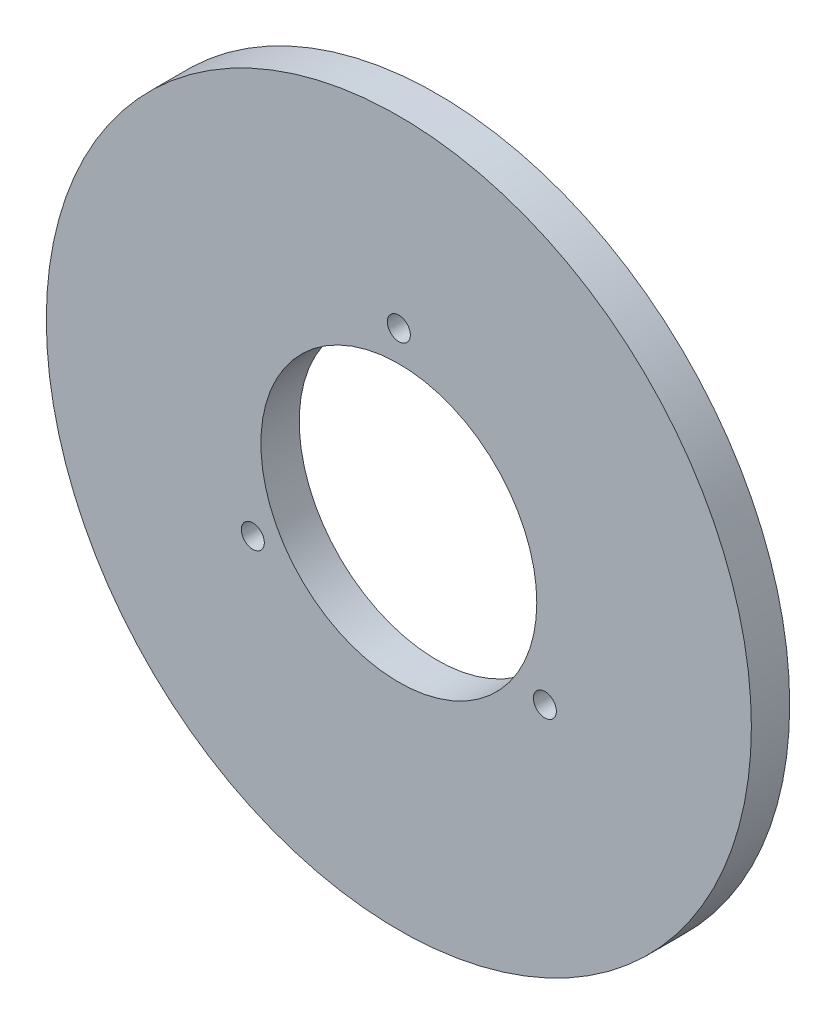
ISO-10303-21;
HEADER;
FILE_DESCRIPTION(('STEP AP214'),'2;1');
FILE_NAME('part.step','',(''),(''),'','','');
FILE_SCHEMA(('AUTOMOTIVE_DESIGN { 1 0 10303 214 1 1 1 1 }'));
ENDSEC;
DATA;
#1=APPLICATION_CONTEXT('core data for automotive mechanical design processes');
#2=APPLICATION_PROTOCOL_DEFINITION('international standard','automotive_design',2000,#1);
#3=PRODUCT_CONTEXT('',#1,'mechanical');
#4=PRODUCT('Part','Part','',(#3));
#5=PRODUCT_RELATED_PRODUCT_CATEGORY('part','',(#4));
#6=PRODUCT_DEFINITION_FORMATION('','',#4);
#7=PRODUCT_DEFINITION_CONTEXT('part definition',#1,'design');
#8=PRODUCT_DEFINITION('design','',#6,#7);
#9=PRODUCT_DEFINITION_SHAPE('','',#8);
#10=(LENGTH_UNIT() NAMED_UNIT(*) SI_UNIT(.MILLI.,.METRE.));
#11=(NAMED_UNIT(*) PLANE_ANGLE_UNIT() SI_UNIT($,.RADIAN.));
#12=(NAMED_UNIT(*) SI_UNIT($,.STERADIAN.) SOLID_ANGLE_UNIT());
#13=UNCERTAINTY_MEASURE_WITH_UNIT(LENGTH_MEASURE(1.E-05),#10,'distance_accuracy_value','');
#14=(GEOMETRIC_REPRESENTATION_CONTEXT(3) GLOBAL_UNCERTAINTY_ASSIGNED_CONTEXT((#13)) GLOBAL_UNIT_ASSIGNED_CONTEXT((#10,
#11,#12)) REPRESENTATION_CONTEXT('',''));
#15=CARTESIAN_POINT('',(0.,0.,0.));
#16=DIRECTION('',(0.,0.,1.));
#17=DIRECTION('',(1.,0.,0.));
#18=AXIS2_PLACEMENT_3D('',#15,#16,#17);
#19=CARTESIAN_POINT('',(0.,0.,5.));
#20=DIRECTION('',(0.,0.,1.));
#21=DIRECTION('',(1.,0.,0.));
#22=AXIS2_PLACEMENT_3D('',#19,#20,#21);
#23=PLANE('',#22);
#24=CARTESIAN_POINT('',(0.,22.,5.));
#25=DIRECTION('',(0.,0.,-1.));
#26=DIRECTION('',(-1.,0.,0.));
#27=AXIS2_PLACEMENT_3D('',#24,#25,#26);
#28=CIRCLE('',#27,1.5);
#29=CARTESIAN_POINT('',(-1.5,22.,5.));
#30=VERTEX_POINT('',#29);
#31=EDGE_CURVE('E53',#30,#30,#28,.T.);
#32=ORIENTED_EDGE('',*,*,#31,.T.);
#33=EDGE_LOOP('',(#32));
#34=FACE_BOUND('',#33,.T.);
#35=CARTESIAN_POINT('',(-19.0525588832577,-11.,5.));
#36=DIRECTION('',(0.,0.,-1.));
#37=DIRECTION('',(-1.,0.,0.));
#38=AXIS2_PLACEMENT_3D('',#35,#36,#37);
#39=CIRCLE('',#38,1.5);
#40=CARTESIAN_POINT('',(-20.5525588832577,-11.,5.));
#41=VERTEX_POINT('',#40);
#42=EDGE_CURVE('E70',#41,#41,#39,.T.);
#43=ORIENTED_EDGE('',*,*,#42,.T.);
#44=EDGE_LOOP('',(#43));
#45=FACE_BOUND('',#44,.T.);
#46=CARTESIAN_POINT('',(19.0525588832576,-11.,5.));
#47=DIRECTION('',(0.,0.,-1.));
#48=DIRECTION('',(-1.,0.,0.));
#49=AXIS2_PLACEMENT_3D('',#46,#47,#48);
#50=CIRCLE('',#49,1.5);
#51=CARTESIAN_POINT('',(17.5525588832576,-11.,5.));
#52=VERTEX_POINT('',#51);
#53=EDGE_CURVE('E67',#52,#52,#50,.T.);
#54=ORIENTED_EDGE('',*,*,#53,.T.);
#55=EDGE_LOOP('',(#54));
#56=FACE_BOUND('',#55,.T.);
#57=CARTESIAN_POINT('',(0.,0.,5.));
#58=DIRECTION('',(0.,0.,1.));
#59=DIRECTION('',(1.,0.,0.));
#60=AXIS2_PLACEMENT_3D('',#57,#58,#59);
#61=CIRCLE('',#60,46.);
#62=CARTESIAN_POINT('',(46.,0.,5.));
#63=VERTEX_POINT('',#62);
#64=EDGE_CURVE('E10',#63,#63,#61,.T.);
#65=ORIENTED_EDGE('',*,*,#64,.T.);
#66=EDGE_LOOP('',(#65));
#67=FACE_BOUND('',#66,.T.);
#68=CARTESIAN_POINT('',(0.,0.,5.));
#69=DIRECTION('',(0.,0.,1.));
#70=DIRECTION('',(1.,0.,0.));
#71=AXIS2_PLACEMENT_3D('',#68,#69,#70);
#72=CIRCLE('',#71,18.);
#73=CARTESIAN_POINT('',(18.,0.,5.));
#74=VERTEX_POINT('',#73);
#75=EDGE_CURVE('E44',#74,#74,#72,.T.);
#76=ORIENTED_EDGE('',*,*,#75,.F.);
#77=EDGE_LOOP('',(#76));
#78=FACE_BOUND('',#77,.T.);
#79=ADVANCED_FACE('F31',(#34,#45,#56,#67,#78),#23,.T.);
#80=CARTESIAN_POINT('',(0.,0.,0.));
#81=DIRECTION('',(0.,0.,1.));
#82=DIRECTION('',(1.,0.,0.));
#83=AXIS2_PLACEMENT_3D('',#80,#81,#82);
#84=PLANE('',#83);
#85=CARTESIAN_POINT('',(0.,22.,0.));
#86=DIRECTION('',(0.,0.,1.));
#87=DIRECTION('',(1.,0.,0.));
#88=AXIS2_PLACEMENT_3D('',#85,#86,#87);
#89=CIRCLE('',#88,1.5);
#90=CARTESIAN_POINT('',(1.5,22.,0.));
#91=VERTEX_POINT('',#90);
#92=EDGE_CURVE('E35',#91,#91,#89,.T.);
#93=ORIENTED_EDGE('',*,*,#92,.T.);
#94=EDGE_LOOP('',(#93));
#95=FACE_BOUND('',#94,.T.);
#96=CARTESIAN_POINT('',(-19.0525588832577,-11.,0.));
#97=DIRECTION('',(0.,0.,1.));
#98=DIRECTION('',(1.,0.,0.));
#99=AXIS2_PLACEMENT_3D('',#96,#97,#98);
#100=CIRCLE('',#99,1.5);
#101=CARTESIAN_POINT('',(-17.5525588832577,-11.,0.));
#102=VERTEX_POINT('',#101);
#103=EDGE_CURVE('E52',#102,#102,#100,.T.);
#104=ORIENTED_EDGE('',*,*,#103,.T.);
#105=EDGE_LOOP('',(#104));
#106=FACE_BOUND('',#105,.T.);
#107=CARTESIAN_POINT('',(19.0525588832576,-11.,0.));
#108=DIRECTION('',(0.,0.,1.));
#109=DIRECTION('',(1.,0.,0.));
#110=AXIS2_PLACEMENT_3D('',#107,#108,#109);
#111=CIRCLE('',#110,1.5);
#112=CARTESIAN_POINT('',(20.5525588832576,-11.,0.));
#113=VERTEX_POINT('',#112);
#114=EDGE_CURVE('E50',#113,#113,#111,.T.);
#115=ORIENTED_EDGE('',*,*,#114,.T.);
#116=EDGE_LOOP('',(#115));
#117=FACE_BOUND('',#116,.T.);
#118=CARTESIAN_POINT('',(0.,0.,0.));
#119=DIRECTION('',(0.,0.,1.));
#120=DIRECTION('',(1.,0.,0.));
#121=AXIS2_PLACEMENT_3D('',#118,#119,#120);
#122=CIRCLE('',#121,46.);
#123=CARTESIAN_POINT('',(46.,0.,0.));
#124=VERTEX_POINT('',#123);
#125=EDGE_CURVE('E39',#124,#124,#122,.T.);
#126=ORIENTED_EDGE('',*,*,#125,.F.);
#127=EDGE_LOOP('',(#126));
#128=FACE_BOUND('',#127,.T.);
#129=CARTESIAN_POINT('',(0.,0.,0.));
#130=DIRECTION('',(0.,0.,1.));
#131=DIRECTION('',(1.,0.,0.));
#132=AXIS2_PLACEMENT_3D('',#129,#130,#131);
#133=CIRCLE('',#132,18.);
#134=CARTESIAN_POINT('',(18.,0.,0.));
#135=VERTEX_POINT('',#134);
#136=EDGE_CURVE('E47',#135,#135,#133,.T.);
#137=ORIENTED_EDGE('',*,*,#136,.T.);
#138=EDGE_LOOP('',(#137));
#139=FACE_BOUND('',#138,.T.);
#140=ADVANCED_FACE('F90',(#95,#106,#117,#128,#139),#84,.F.);
#141=CARTESIAN_POINT('',(0.,0.,5.));
#142=DIRECTION('',(0.,0.,-1.));
#143=DIRECTION('',(-1.,0.,0.));
#144=AXIS2_PLACEMENT_3D('',#141,#142,#143);
#145=CYLINDRICAL_SURFACE('',#144,46.);
#146=ORIENTED_EDGE('',*,*,#64,.F.);
#147=EDGE_LOOP('',(#146));
#148=FACE_BOUND('',#147,.T.);
#149=ORIENTED_EDGE('',*,*,#125,.T.);
#150=EDGE_LOOP('',(#149));
#151=FACE_BOUND('',#150,.T.);
#152=ADVANCED_FACE('F33',(#148,#151),#145,.T.);
#153=CARTESIAN_POINT('',(0.,0.,5.));
#154=DIRECTION('',(0.,0.,-1.));
#155=DIRECTION('',(-1.,0.,0.));
#156=AXIS2_PLACEMENT_3D('',#153,#154,#155);
#157=CYLINDRICAL_SURFACE('',#156,18.);
#158=ORIENTED_EDGE('',*,*,#75,.T.);
#159=EDGE_LOOP('',(#158));
#160=FACE_BOUND('',#159,.T.);
#161=ORIENTED_EDGE('',*,*,#136,.F.);
#162=EDGE_LOOP('',(#161));
#163=FACE_BOUND('',#162,.T.);
#164=ADVANCED_FACE('F96',(#160,#163),#157,.F.);
#165=CARTESIAN_POINT('',(19.0525588832576,-11.,5.));
#166=DIRECTION('',(0.,0.,-1.));
#167=DIRECTION('',(-1.,0.,0.));
#168=AXIS2_PLACEMENT_3D('',#165,#166,#167);
#169=CYLINDRICAL_SURFACE('',#168,1.5);
#170=ORIENTED_EDGE('',*,*,#53,.F.);
#171=EDGE_LOOP('',(#170));
#172=FACE_BOUND('',#171,.T.);
#173=ORIENTED_EDGE('',*,*,#114,.F.);
#174=EDGE_LOOP('',(#173));
#175=FACE_BOUND('',#174,.T.);
#176=ADVANCED_FACE('F86',(#172,#175),#169,.F.);
#177=CARTESIAN_POINT('',(-19.0525588832577,-11.,5.));
#178=DIRECTION('',(0.,0.,-1.));
#179=DIRECTION('',(-1.,0.,0.));
#180=AXIS2_PLACEMENT_3D('',#177,#178,#179);
#181=CYLINDRICAL_SURFACE('',#180,1.5);
#182=ORIENTED_EDGE('',*,*,#42,.F.);
#183=EDGE_LOOP('',(#182));
#184=FACE_BOUND('',#183,.T.);
#185=ORIENTED_EDGE('',*,*,#103,.F.);
#186=EDGE_LOOP('',(#185));
#187=FACE_BOUND('',#186,.T.);
#188=ADVANCED_FACE('F81',(#184,#187),#181,.F.);
#189=CARTESIAN_POINT('',(0.,22.,5.));
#190=DIRECTION('',(0.,0.,-1.));
#191=DIRECTION('',(-1.,0.,0.));
#192=AXIS2_PLACEMENT_3D('',#189,#190,#191);
#193=CYLINDRICAL_SURFACE('',#192,1.5);
#194=ORIENTED_EDGE('',*,*,#31,.F.);
#195=EDGE_LOOP('',(#194));
#196=FACE_BOUND('',#195,.T.);
#197=ORIENTED_EDGE('',*,*,#92,.F.);
#198=EDGE_LOOP('',(#197));
#199=FACE_BOUND('',#198,.T.);
#200=ADVANCED_FACE('F78',(#196,#199),#193,.F.);
#201=CLOSED_SHELL('',(#79,#140,#152,#164,#176,#188,#200));
#202=MANIFOLD_SOLID_BREP('B2',#201);
#203=ADVANCED_BREP_SHAPE_REPRESENTATION('',(#18,#202),#14);
#204=SHAPE_DEFINITION_REPRESENTATION(#9,#203);
ENDSEC;
END-ISO-10303-21;
